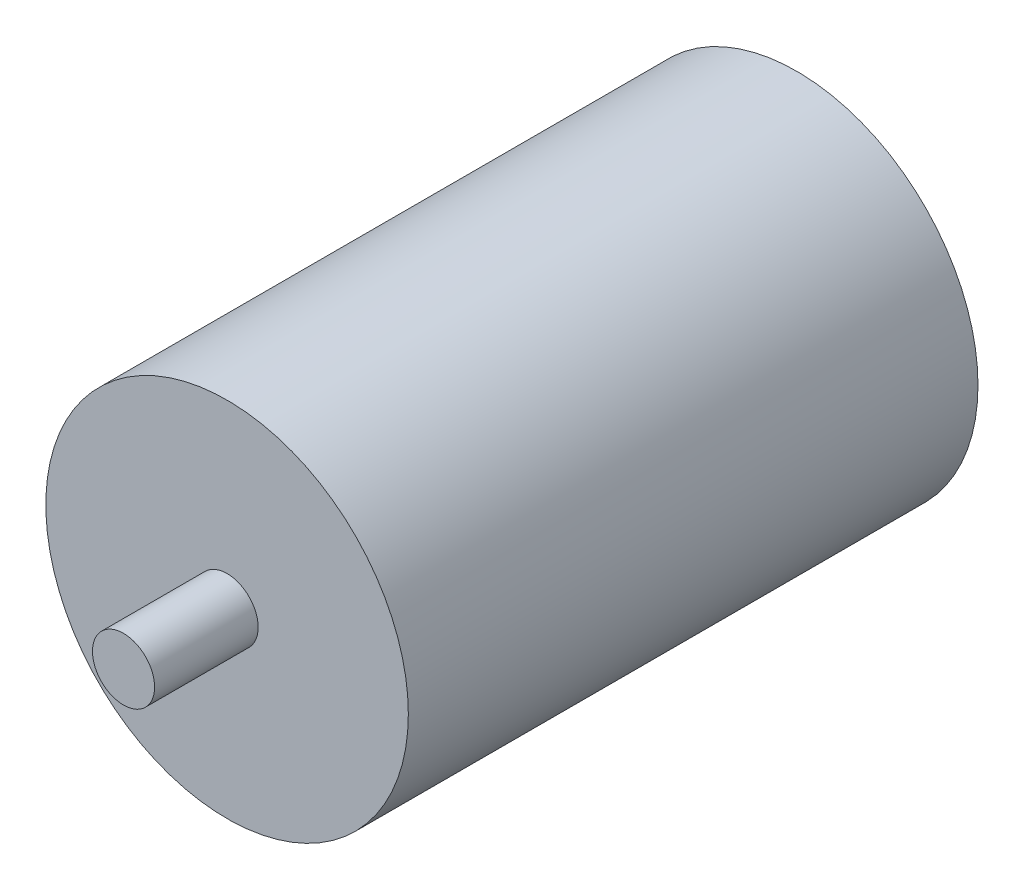
ISO-10303-21;
HEADER;
FILE_DESCRIPTION(('STEP AP214'),'2;1');
FILE_NAME('part.step','',(''),(''),'','','');
FILE_SCHEMA(('AUTOMOTIVE_DESIGN { 1 0 10303 214 1 1 1 1 }'));
ENDSEC;
DATA;
#1=APPLICATION_CONTEXT('core data for automotive mechanical design processes');
#2=APPLICATION_PROTOCOL_DEFINITION('international standard','automotive_design',2000,#1);
#3=PRODUCT_CONTEXT('',#1,'mechanical');
#4=PRODUCT('Part','Part','',(#3));
#5=PRODUCT_RELATED_PRODUCT_CATEGORY('part','',(#4));
#6=PRODUCT_DEFINITION_FORMATION('','',#4);
#7=PRODUCT_DEFINITION_CONTEXT('part definition',#1,'design');
#8=PRODUCT_DEFINITION('design','',#6,#7);
#9=PRODUCT_DEFINITION_SHAPE('','',#8);
#10=(LENGTH_UNIT() NAMED_UNIT(*) SI_UNIT(.MILLI.,.METRE.));
#11=(NAMED_UNIT(*) PLANE_ANGLE_UNIT() SI_UNIT($,.RADIAN.));
#12=(NAMED_UNIT(*) SI_UNIT($,.STERADIAN.) SOLID_ANGLE_UNIT());
#13=UNCERTAINTY_MEASURE_WITH_UNIT(LENGTH_MEASURE(1.E-05),#10,'distance_accuracy_value','');
#14=(GEOMETRIC_REPRESENTATION_CONTEXT(3) GLOBAL_UNCERTAINTY_ASSIGNED_CONTEXT((#13)) GLOBAL_UNIT_ASSIGNED_CONTEXT((#10,
#11,#12)) REPRESENTATION_CONTEXT('',''));
#15=CARTESIAN_POINT('',(0.,0.,0.));
#16=DIRECTION('',(0.,0.,1.));
#17=DIRECTION('',(1.,0.,0.));
#18=AXIS2_PLACEMENT_3D('',#15,#16,#17);
#19=CARTESIAN_POINT('',(0.,0.,139.7));
#20=DIRECTION('',(0.,0.,1.));
#21=DIRECTION('',(1.,0.,0.));
#22=AXIS2_PLACEMENT_3D('',#19,#20,#21);
#23=PLANE('',#22);
#24=CARTESIAN_POINT('',(0.,0.,139.7));
#25=DIRECTION('',(0.,0.,1.));
#26=DIRECTION('',(1.,0.,0.));
#27=AXIS2_PLACEMENT_3D('',#24,#25,#26);
#28=CIRCLE('',#27,44.45);
#29=CARTESIAN_POINT('',(44.45,0.,139.7));
#30=VERTEX_POINT('',#29);
#31=EDGE_CURVE('E46',#30,#30,#28,.T.);
#32=ORIENTED_EDGE('',*,*,#31,.T.);
#33=EDGE_LOOP('',(#32));
#34=FACE_BOUND('',#33,.T.);
#35=CARTESIAN_POINT('',(0.,0.,139.7));
#36=DIRECTION('',(0.,0.,1.));
#37=DIRECTION('',(1.,0.,0.));
#38=AXIS2_PLACEMENT_3D('',#35,#36,#37);
#39=CIRCLE('',#38,7.62);
#40=CARTESIAN_POINT('',(7.62,0.,139.7));
#41=VERTEX_POINT('',#40);
#42=EDGE_CURVE('E52',#41,#41,#39,.T.);
#43=ORIENTED_EDGE('',*,*,#42,.F.);
#44=EDGE_LOOP('',(#43));
#45=FACE_BOUND('',#44,.T.);
#46=ADVANCED_FACE('F31',(#34,#45),#23,.T.);
#47=CARTESIAN_POINT('',(0.,0.,0.));
#48=DIRECTION('',(0.,0.,1.));
#49=DIRECTION('',(1.,0.,0.));
#50=AXIS2_PLACEMENT_3D('',#47,#48,#49);
#51=PLANE('',#50);
#52=CARTESIAN_POINT('',(0.,0.,0.));
#53=DIRECTION('',(0.,0.,1.));
#54=DIRECTION('',(1.,0.,0.));
#55=AXIS2_PLACEMENT_3D('',#52,#53,#54);
#56=CIRCLE('',#55,44.45);
#57=CARTESIAN_POINT('',(44.45,0.,0.));
#58=VERTEX_POINT('',#57);
#59=EDGE_CURVE('E10',#58,#58,#56,.T.);
#60=ORIENTED_EDGE('',*,*,#59,.F.);
#61=EDGE_LOOP('',(#60));
#62=FACE_BOUND('',#61,.T.);
#63=CARTESIAN_POINT('',(0.,0.,0.));
#64=DIRECTION('',(0.,0.,1.));
#65=DIRECTION('',(1.,0.,0.));
#66=AXIS2_PLACEMENT_3D('',#63,#64,#65);
#67=CIRCLE('',#66,38.1);
#68=CARTESIAN_POINT('',(38.1,0.,0.));
#69=VERTEX_POINT('',#68);
#70=EDGE_CURVE('E38',#69,#69,#67,.T.);
#71=ORIENTED_EDGE('',*,*,#70,.T.);
#72=EDGE_LOOP('',(#71));
#73=FACE_BOUND('',#72,.T.);
#74=ADVANCED_FACE('F68',(#62,#73),#51,.F.);
#75=CARTESIAN_POINT('',(0.,0.,127.));
#76=DIRECTION('',(0.,0.,-1.));
#77=DIRECTION('',(-1.,0.,0.));
#78=AXIS2_PLACEMENT_3D('',#75,#76,#77);
#79=CYLINDRICAL_SURFACE('',#78,44.45);
#80=ORIENTED_EDGE('',*,*,#59,.T.);
#81=EDGE_LOOP('',(#80));
#82=FACE_BOUND('',#81,.T.);
#83=ORIENTED_EDGE('',*,*,#31,.F.);
#84=EDGE_LOOP('',(#83));
#85=FACE_BOUND('',#84,.T.);
#86=ADVANCED_FACE('F33',(#82,#85),#79,.T.);
#87=CARTESIAN_POINT('',(0.,0.,127.));
#88=DIRECTION('',(0.,0.,-1.));
#89=DIRECTION('',(-1.,0.,0.));
#90=AXIS2_PLACEMENT_3D('',#87,#88,#89);
#91=CYLINDRICAL_SURFACE('',#90,38.1);
#92=CARTESIAN_POINT('',(0.,0.,127.));
#93=DIRECTION('',(0.,0.,1.));
#94=DIRECTION('',(1.,0.,0.));
#95=AXIS2_PLACEMENT_3D('',#92,#93,#94);
#96=CIRCLE('',#95,38.1);
#97=CARTESIAN_POINT('',(38.1,0.,127.));
#98=VERTEX_POINT('',#97);
#99=EDGE_CURVE('E42',#98,#98,#96,.T.);
#100=ORIENTED_EDGE('',*,*,#99,.T.);
#101=EDGE_LOOP('',(#100));
#102=FACE_BOUND('',#101,.T.);
#103=ORIENTED_EDGE('',*,*,#70,.F.);
#104=EDGE_LOOP('',(#103));
#105=FACE_BOUND('',#104,.T.);
#106=ADVANCED_FACE('F79',(#102,#105),#91,.F.);
#107=CARTESIAN_POINT('',(0.,0.,127.));
#108=DIRECTION('',(0.,0.,1.));
#109=DIRECTION('',(1.,0.,0.));
#110=AXIS2_PLACEMENT_3D('',#107,#108,#109);
#111=PLANE('',#110);
#112=ORIENTED_EDGE('',*,*,#99,.F.);
#113=EDGE_LOOP('',(#112));
#114=FACE_BOUND('',#113,.T.);
#115=ADVANCED_FACE('F63',(#114),#111,.F.);
#116=CARTESIAN_POINT('',(0.,0.,165.1));
#117=DIRECTION('',(0.,0.,-1.));
#118=DIRECTION('',(-1.,0.,0.));
#119=AXIS2_PLACEMENT_3D('',#116,#117,#118);
#120=CYLINDRICAL_SURFACE('',#119,7.62);
#121=CARTESIAN_POINT('',(0.,0.,165.1));
#122=DIRECTION('',(0.,0.,1.));
#123=DIRECTION('',(1.,0.,0.));
#124=AXIS2_PLACEMENT_3D('',#121,#122,#123);
#125=CIRCLE('',#124,7.62);
#126=CARTESIAN_POINT('',(7.62,0.,165.1));
#127=VERTEX_POINT('',#126);
#128=EDGE_CURVE('E51',#127,#127,#125,.T.);
#129=ORIENTED_EDGE('',*,*,#128,.F.);
#130=EDGE_LOOP('',(#129));
#131=FACE_BOUND('',#130,.T.);
#132=ORIENTED_EDGE('',*,*,#42,.T.);
#133=EDGE_LOOP('',(#132));
#134=FACE_BOUND('',#133,.T.);
#135=ADVANCED_FACE('F60',(#131,#134),#120,.T.);
#136=CARTESIAN_POINT('',(0.,0.,165.1));
#137=DIRECTION('',(0.,0.,1.));
#138=DIRECTION('',(1.,0.,0.));
#139=AXIS2_PLACEMENT_3D('',#136,#137,#138);
#140=PLANE('',#139);
#141=ORIENTED_EDGE('',*,*,#128,.T.);
#142=EDGE_LOOP('',(#141));
#143=FACE_BOUND('',#142,.T.);
#144=ADVANCED_FACE('F58',(#143),#140,.T.);
#145=CLOSED_SHELL('',(#46,#74,#86,#106,#115,#135,#144));
#146=MANIFOLD_SOLID_BREP('B2',#145);
#147=ADVANCED_BREP_SHAPE_REPRESENTATION('',(#18,#146),#14);
#148=SHAPE_DEFINITION_REPRESENTATION(#9,#147);
ENDSEC;
END-ISO-10303-21;
